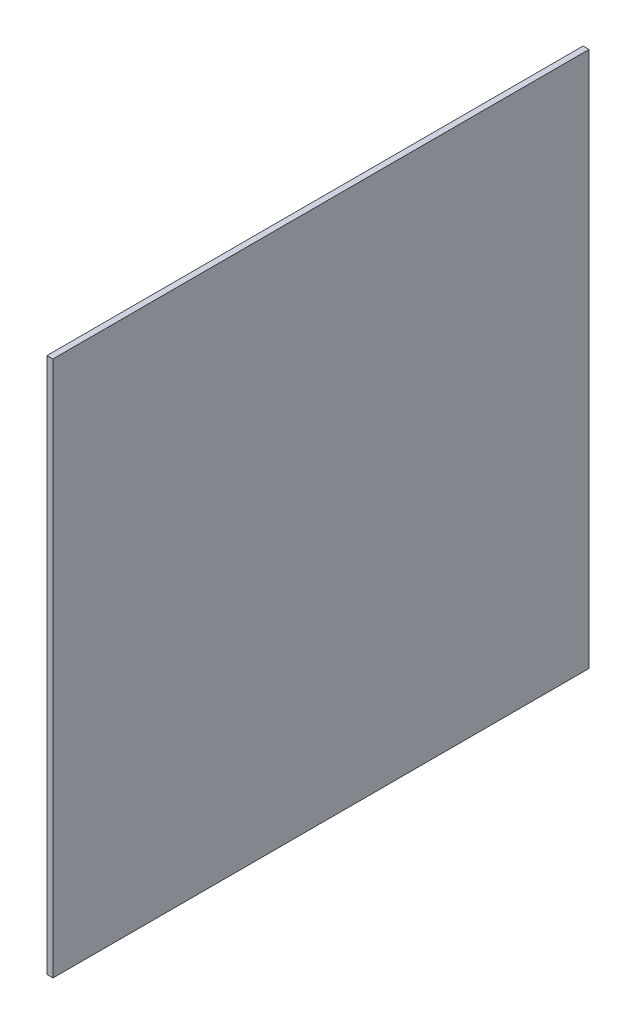
ISO-10303-21;
HEADER;
FILE_DESCRIPTION(('STEP AP214'),'2;1');
FILE_NAME('part.step','',(''),(''),'','','');
FILE_SCHEMA(('AUTOMOTIVE_DESIGN { 1 0 10303 214 1 1 1 1 }'));
ENDSEC;
DATA;
#1=APPLICATION_CONTEXT('core data for automotive mechanical design processes');
#2=APPLICATION_PROTOCOL_DEFINITION('international standard','automotive_design',2000,#1);
#3=PRODUCT_CONTEXT('',#1,'mechanical');
#4=PRODUCT('Part','Part','',(#3));
#5=PRODUCT_RELATED_PRODUCT_CATEGORY('part','',(#4));
#6=PRODUCT_DEFINITION_FORMATION('','',#4);
#7=PRODUCT_DEFINITION_CONTEXT('part definition',#1,'design');
#8=PRODUCT_DEFINITION('design','',#6,#7);
#9=PRODUCT_DEFINITION_SHAPE('','',#8);
#10=(LENGTH_UNIT() NAMED_UNIT(*) SI_UNIT(.MILLI.,.METRE.));
#11=(NAMED_UNIT(*) PLANE_ANGLE_UNIT() SI_UNIT($,.RADIAN.));
#12=(NAMED_UNIT(*) SI_UNIT($,.STERADIAN.) SOLID_ANGLE_UNIT());
#13=UNCERTAINTY_MEASURE_WITH_UNIT(LENGTH_MEASURE(1.E-05),#10,'distance_accuracy_value','');
#14=(GEOMETRIC_REPRESENTATION_CONTEXT(3) GLOBAL_UNCERTAINTY_ASSIGNED_CONTEXT((#13)) GLOBAL_UNIT_ASSIGNED_CONTEXT((#10,
#11,#12)) REPRESENTATION_CONTEXT('',''));
#15=CARTESIAN_POINT('',(0.,0.,0.));
#16=DIRECTION('',(0.,0.,1.));
#17=DIRECTION('',(1.,0.,0.));
#18=AXIS2_PLACEMENT_3D('',#15,#16,#17);
#19=CARTESIAN_POINT('',(3.175,-285.75,-285.75));
#20=DIRECTION('',(0.,0.,1.));
#21=DIRECTION('',(1.,0.,0.));
#22=AXIS2_PLACEMENT_3D('',#19,#20,#21);
#23=PLANE('',#22);
#24=DIRECTION('',(-1.,0.,0.));
#25=VECTOR('',#24,1.);
#26=CARTESIAN_POINT('',(3.175,-285.75,-285.75));
#27=LINE('',#26,#25);
#28=CARTESIAN_POINT('',(3.175,-285.75,-285.75));
#29=VERTEX_POINT('',#28);
#30=CARTESIAN_POINT('',(-3.175,-285.75,-285.75));
#31=VERTEX_POINT('',#30);
#32=EDGE_CURVE('E90',#29,#31,#27,.T.);
#33=ORIENTED_EDGE('',*,*,#32,.T.);
#34=DIRECTION('',(0.,1.,0.));
#35=VECTOR('',#34,1.);
#36=CARTESIAN_POINT('',(-3.175,-285.75,-285.75));
#37=LINE('',#36,#35);
#38=CARTESIAN_POINT('',(-3.175,285.75,-285.75));
#39=VERTEX_POINT('',#38);
#40=EDGE_CURVE('E85',#31,#39,#37,.T.);
#41=ORIENTED_EDGE('',*,*,#40,.T.);
#42=DIRECTION('',(-1.,0.,0.));
#43=VECTOR('',#42,1.);
#44=CARTESIAN_POINT('',(3.175,285.75,-285.75));
#45=LINE('',#44,#43);
#46=CARTESIAN_POINT('',(3.175,285.75,-285.75));
#47=VERTEX_POINT('',#46);
#48=EDGE_CURVE('E11',#47,#39,#45,.T.);
#49=ORIENTED_EDGE('',*,*,#48,.F.);
#50=DIRECTION('',(0.,1.,0.));
#51=VECTOR('',#50,1.);
#52=CARTESIAN_POINT('',(3.175,-285.75,-285.75));
#53=LINE('',#52,#51);
#54=EDGE_CURVE('E96',#29,#47,#53,.T.);
#55=ORIENTED_EDGE('',*,*,#54,.F.);
#56=EDGE_LOOP('',(#33,#41,#49,#55));
#57=FACE_BOUND('',#56,.T.);
#58=ADVANCED_FACE('F33',(#57),#23,.F.);
#59=CARTESIAN_POINT('',(3.175,285.75,285.75));
#60=DIRECTION('',(0.,-1.,0.));
#61=DIRECTION('',(0.,0.,-1.));
#62=AXIS2_PLACEMENT_3D('',#59,#60,#61);
#63=PLANE('',#62);
#64=ORIENTED_EDGE('',*,*,#48,.T.);
#65=DIRECTION('',(0.,0.,1.));
#66=VECTOR('',#65,1.);
#67=CARTESIAN_POINT('',(-3.175,285.75,285.75));
#68=LINE('',#67,#66);
#69=CARTESIAN_POINT('',(-3.175,285.75,285.75));
#70=VERTEX_POINT('',#69);
#71=EDGE_CURVE('E75',#39,#70,#68,.T.);
#72=ORIENTED_EDGE('',*,*,#71,.T.);
#73=DIRECTION('',(-1.,0.,0.));
#74=VECTOR('',#73,1.);
#75=CARTESIAN_POINT('',(3.175,285.75,285.75));
#76=LINE('',#75,#74);
#77=CARTESIAN_POINT('',(3.175,285.75,285.75));
#78=VERTEX_POINT('',#77);
#79=EDGE_CURVE('E40',#78,#70,#76,.T.);
#80=ORIENTED_EDGE('',*,*,#79,.F.);
#81=DIRECTION('',(0.,0.,1.));
#82=VECTOR('',#81,1.);
#83=CARTESIAN_POINT('',(3.175,285.75,285.75));
#84=LINE('',#83,#82);
#85=EDGE_CURVE('E76',#47,#78,#84,.T.);
#86=ORIENTED_EDGE('',*,*,#85,.F.);
#87=EDGE_LOOP('',(#64,#72,#80,#86));
#88=FACE_BOUND('',#87,.T.);
#89=ADVANCED_FACE('F73',(#88),#63,.F.);
#90=CARTESIAN_POINT('',(3.175,-285.75,285.75));
#91=DIRECTION('',(0.,0.,-1.));
#92=DIRECTION('',(-1.,0.,0.));
#93=AXIS2_PLACEMENT_3D('',#90,#91,#92);
#94=PLANE('',#93);
#95=ORIENTED_EDGE('',*,*,#79,.T.);
#96=DIRECTION('',(0.,-1.,0.));
#97=VECTOR('',#96,1.);
#98=CARTESIAN_POINT('',(-3.175,-285.75,285.75));
#99=LINE('',#98,#97);
#100=CARTESIAN_POINT('',(-3.175,-285.75,285.75));
#101=VERTEX_POINT('',#100);
#102=EDGE_CURVE('E88',#70,#101,#99,.T.);
#103=ORIENTED_EDGE('',*,*,#102,.T.);
#104=DIRECTION('',(-1.,0.,0.));
#105=VECTOR('',#104,1.);
#106=CARTESIAN_POINT('',(3.175,-285.75,285.75));
#107=LINE('',#106,#105);
#108=CARTESIAN_POINT('',(3.175,-285.75,285.75));
#109=VERTEX_POINT('',#108);
#110=EDGE_CURVE('E102',#109,#101,#107,.T.);
#111=ORIENTED_EDGE('',*,*,#110,.F.);
#112=DIRECTION('',(0.,-1.,0.));
#113=VECTOR('',#112,1.);
#114=CARTESIAN_POINT('',(3.175,-285.75,285.75));
#115=LINE('',#114,#113);
#116=EDGE_CURVE('E52',#78,#109,#115,.T.);
#117=ORIENTED_EDGE('',*,*,#116,.F.);
#118=EDGE_LOOP('',(#95,#103,#111,#117));
#119=FACE_BOUND('',#118,.T.);
#120=ADVANCED_FACE('F104',(#119),#94,.F.);
#121=CARTESIAN_POINT('',(3.175,-285.75,285.75));
#122=DIRECTION('',(0.,1.,0.));
#123=DIRECTION('',(0.,0.,1.));
#124=AXIS2_PLACEMENT_3D('',#121,#122,#123);
#125=PLANE('',#124);
#126=ORIENTED_EDGE('',*,*,#110,.T.);
#127=DIRECTION('',(0.,0.,-1.));
#128=VECTOR('',#127,1.);
#129=CARTESIAN_POINT('',(-3.175,-285.75,285.75));
#130=LINE('',#129,#128);
#131=EDGE_CURVE('E94',#101,#31,#130,.T.);
#132=ORIENTED_EDGE('',*,*,#131,.T.);
#133=ORIENTED_EDGE('',*,*,#32,.F.);
#134=DIRECTION('',(0.,0.,-1.));
#135=VECTOR('',#134,1.);
#136=CARTESIAN_POINT('',(3.175,-285.75,285.75));
#137=LINE('',#136,#135);
#138=EDGE_CURVE('E47',#109,#29,#137,.T.);
#139=ORIENTED_EDGE('',*,*,#138,.F.);
#140=EDGE_LOOP('',(#126,#132,#133,#139));
#141=FACE_BOUND('',#140,.T.);
#142=ADVANCED_FACE('F106',(#141),#125,.F.);
#143=CARTESIAN_POINT('',(3.175,0.,0.));
#144=DIRECTION('',(-1.,0.,0.));
#145=DIRECTION('',(0.,0.,1.));
#146=AXIS2_PLACEMENT_3D('',#143,#144,#145);
#147=PLANE('',#146);
#148=ORIENTED_EDGE('',*,*,#54,.T.);
#149=ORIENTED_EDGE('',*,*,#85,.T.);
#150=ORIENTED_EDGE('',*,*,#116,.T.);
#151=ORIENTED_EDGE('',*,*,#138,.T.);
#152=EDGE_LOOP('',(#148,#149,#150,#151));
#153=FACE_BOUND('',#152,.T.);
#154=ADVANCED_FACE('F107',(#153),#147,.F.);
#155=CARTESIAN_POINT('',(-3.175,0.,0.));
#156=DIRECTION('',(-1.,0.,0.));
#157=DIRECTION('',(0.,0.,1.));
#158=AXIS2_PLACEMENT_3D('',#155,#156,#157);
#159=PLANE('',#158);
#160=ORIENTED_EDGE('',*,*,#40,.F.);
#161=ORIENTED_EDGE('',*,*,#131,.F.);
#162=ORIENTED_EDGE('',*,*,#102,.F.);
#163=ORIENTED_EDGE('',*,*,#71,.F.);
#164=EDGE_LOOP('',(#160,#161,#162,#163));
#165=FACE_BOUND('',#164,.T.);
#166=ADVANCED_FACE('F83',(#165),#159,.T.);
#167=CLOSED_SHELL('',(#58,#89,#120,#142,#154,#166));
#168=MANIFOLD_SOLID_BREP('B2',#167);
#169=ADVANCED_BREP_SHAPE_REPRESENTATION('',(#18,#168),#14);
#170=SHAPE_DEFINITION_REPRESENTATION(#9,#169);
ENDSEC;
END-ISO-10303-21;
